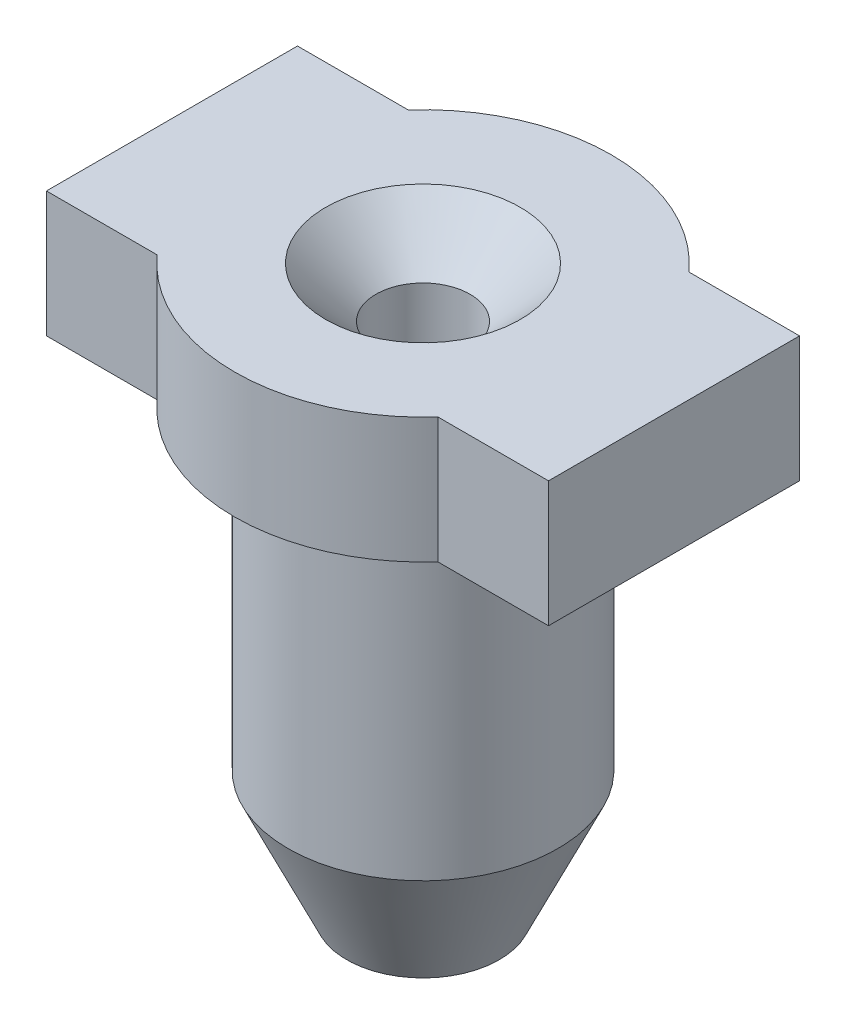
ISO-10303-21;
HEADER;
FILE_DESCRIPTION(('STEP AP214'),'2;1');
FILE_NAME('part.step','',(''),(''),'','','');
FILE_SCHEMA(('AUTOMOTIVE_DESIGN { 1 0 10303 214 1 1 1 1 }'));
ENDSEC;
DATA;
#1=APPLICATION_CONTEXT('core data for automotive mechanical design processes');
#2=APPLICATION_PROTOCOL_DEFINITION('international standard','automotive_design',2000,#1);
#3=PRODUCT_CONTEXT('',#1,'mechanical');
#4=PRODUCT('Part','Part','',(#3));
#5=PRODUCT_RELATED_PRODUCT_CATEGORY('part','',(#4));
#6=PRODUCT_DEFINITION_FORMATION('','',#4);
#7=PRODUCT_DEFINITION_CONTEXT('part definition',#1,'design');
#8=PRODUCT_DEFINITION('design','',#6,#7);
#9=PRODUCT_DEFINITION_SHAPE('','',#8);
#10=(LENGTH_UNIT() NAMED_UNIT(*) SI_UNIT(.MILLI.,.METRE.));
#11=(NAMED_UNIT(*) PLANE_ANGLE_UNIT() SI_UNIT($,.RADIAN.));
#12=(NAMED_UNIT(*) SI_UNIT($,.STERADIAN.) SOLID_ANGLE_UNIT());
#13=UNCERTAINTY_MEASURE_WITH_UNIT(LENGTH_MEASURE(1.E-05),#10,'distance_accuracy_value','');
#14=(GEOMETRIC_REPRESENTATION_CONTEXT(3) GLOBAL_UNCERTAINTY_ASSIGNED_CONTEXT((#13)) GLOBAL_UNIT_ASSIGNED_CONTEXT((#10,
#11,#12)) REPRESENTATION_CONTEXT('',''));
#15=CARTESIAN_POINT('',(0.,0.,0.));
#16=DIRECTION('',(0.,0.,1.));
#17=DIRECTION('',(1.,0.,0.));
#18=AXIS2_PLACEMENT_3D('',#15,#16,#17);
#19=CARTESIAN_POINT('',(0.,10.,0.));
#20=DIRECTION('',(0.,-1.,0.));
#21=DIRECTION('',(0.,0.,-1.));
#22=AXIS2_PLACEMENT_3D('',#19,#20,#21);
#23=CYLINDRICAL_SURFACE('',#22,15.);
#24=DIRECTION('',(0.,-1.,0.));
#25=VECTOR('',#24,1.);
#26=CARTESIAN_POINT('',(-11.1803398874989,10.,-10.));
#27=LINE('',#26,#25);
#28=CARTESIAN_POINT('',(-11.1803398874989,10.,-10.));
#29=VERTEX_POINT('',#28);
#30=CARTESIAN_POINT('',(-11.1803398874989,0.,-10.));
#31=VERTEX_POINT('',#30);
#32=EDGE_CURVE('E69',#29,#31,#27,.T.);
#33=ORIENTED_EDGE('',*,*,#32,.F.);
#34=CARTESIAN_POINT('',(0.,10.,0.));
#35=DIRECTION('',(0.,1.,0.));
#36=DIRECTION('',(0.,0.,1.));
#37=AXIS2_PLACEMENT_3D('',#34,#35,#36);
#38=CIRCLE('',#37,15.);
#39=CARTESIAN_POINT('',(11.1803398874989,10.,-10.));
#40=VERTEX_POINT('',#39);
#41=EDGE_CURVE('E182',#40,#29,#38,.T.);
#42=ORIENTED_EDGE('',*,*,#41,.F.);
#43=DIRECTION('',(0.,-1.,0.));
#44=VECTOR('',#43,1.);
#45=CARTESIAN_POINT('',(11.1803398874989,10.,-10.));
#46=LINE('',#45,#44);
#47=CARTESIAN_POINT('',(11.1803398874989,0.,-10.));
#48=VERTEX_POINT('',#47);
#49=EDGE_CURVE('E162',#48,#40,#46,.F.);
#50=ORIENTED_EDGE('',*,*,#49,.F.);
#51=CARTESIAN_POINT('',(0.,0.,0.));
#52=DIRECTION('',(0.,1.,0.));
#53=DIRECTION('',(0.,0.,1.));
#54=AXIS2_PLACEMENT_3D('',#51,#52,#53);
#55=CIRCLE('',#54,15.);
#56=EDGE_CURVE('E183',#48,#31,#55,.T.);
#57=ORIENTED_EDGE('',*,*,#56,.T.);
#58=EDGE_LOOP('',(#33,#42,#50,#57));
#59=FACE_BOUND('',#58,.T.);
#60=ADVANCED_FACE('F45',(#59),#23,.T.);
#61=CARTESIAN_POINT('',(-11.180339887499,10.,10.));
#62=VERTEX_POINT('',#61);
#63=CARTESIAN_POINT('',(11.180339887499,10.,10.));
#64=VERTEX_POINT('',#63);
#65=EDGE_CURVE('E61',#62,#64,#38,.T.);
#66=ORIENTED_EDGE('',*,*,#65,.F.);
#67=DIRECTION('',(0.,-1.,0.));
#68=VECTOR('',#67,1.);
#69=CARTESIAN_POINT('',(-11.180339887499,10.,10.));
#70=LINE('',#69,#68);
#71=CARTESIAN_POINT('',(-11.180339887499,0.,10.));
#72=VERTEX_POINT('',#71);
#73=EDGE_CURVE('E159',#62,#72,#70,.T.);
#74=ORIENTED_EDGE('',*,*,#73,.T.);
#75=CARTESIAN_POINT('',(11.180339887499,0.,10.));
#76=VERTEX_POINT('',#75);
#77=EDGE_CURVE('E119',#72,#76,#55,.T.);
#78=ORIENTED_EDGE('',*,*,#77,.T.);
#79=DIRECTION('',(0.,-1.,0.));
#80=VECTOR('',#79,1.);
#81=CARTESIAN_POINT('',(11.180339887499,10.,10.));
#82=LINE('',#81,#80);
#83=EDGE_CURVE('E156',#76,#64,#82,.F.);
#84=ORIENTED_EDGE('',*,*,#83,.T.);
#85=EDGE_LOOP('',(#66,#74,#78,#84));
#86=FACE_BOUND('',#85,.T.);
#87=ADVANCED_FACE('F211',(#86),#23,.T.);
#88=CARTESIAN_POINT('',(0.,10.,0.));
#89=DIRECTION('',(0.,1.,0.));
#90=DIRECTION('',(0.,0.,1.));
#91=AXIS2_PLACEMENT_3D('',#88,#89,#90);
#92=PLANE('',#91);
#93=ORIENTED_EDGE('',*,*,#65,.T.);
#94=DIRECTION('',(1.,0.,0.));
#95=VECTOR('',#94,1.);
#96=CARTESIAN_POINT('',(0.,10.,10.));
#97=LINE('',#96,#95);
#98=CARTESIAN_POINT('',(20.,10.,10.));
#99=VERTEX_POINT('',#98);
#100=EDGE_CURVE('E263',#64,#99,#97,.T.);
#101=ORIENTED_EDGE('',*,*,#100,.T.);
#102=DIRECTION('',(0.,0.,1.));
#103=VECTOR('',#102,1.);
#104=CARTESIAN_POINT('',(20.,10.,0.));
#105=LINE('',#104,#103);
#106=CARTESIAN_POINT('',(20.,10.,-10.));
#107=VERTEX_POINT('',#106);
#108=EDGE_CURVE('E277',#107,#99,#105,.T.);
#109=ORIENTED_EDGE('',*,*,#108,.F.);
#110=DIRECTION('',(1.,0.,0.));
#111=VECTOR('',#110,1.);
#112=CARTESIAN_POINT('',(0.,10.,-10.));
#113=LINE('',#112,#111);
#114=EDGE_CURVE('E281',#40,#107,#113,.T.);
#115=ORIENTED_EDGE('',*,*,#114,.F.);
#116=ORIENTED_EDGE('',*,*,#41,.T.);
#117=CARTESIAN_POINT('',(-20.,10.,-10.));
#118=VERTEX_POINT('',#117);
#119=EDGE_CURVE('E153',#118,#29,#113,.T.);
#120=ORIENTED_EDGE('',*,*,#119,.F.);
#121=DIRECTION('',(0.,0.,1.));
#122=VECTOR('',#121,1.);
#123=CARTESIAN_POINT('',(-20.,10.,0.));
#124=LINE('',#123,#122);
#125=CARTESIAN_POINT('',(-20.,10.,10.));
#126=VERTEX_POINT('',#125);
#127=EDGE_CURVE('E271',#118,#126,#124,.T.);
#128=ORIENTED_EDGE('',*,*,#127,.T.);
#129=EDGE_CURVE('E132',#126,#62,#97,.T.);
#130=ORIENTED_EDGE('',*,*,#129,.T.);
#131=EDGE_LOOP('',(#93,#101,#109,#115,#116,#120,#128,#130));
#132=FACE_BOUND('',#131,.T.);
#133=CARTESIAN_POINT('',(0.,10.,0.));
#134=DIRECTION('',(0.,1.,0.));
#135=DIRECTION('',(0.,0.,1.));
#136=AXIS2_PLACEMENT_3D('',#133,#134,#135);
#137=CIRCLE('',#136,7.75000000000001);
#138=CARTESIAN_POINT('',(0.,10.,7.75000000000001));
#139=VERTEX_POINT('',#138);
#140=EDGE_CURVE('E190',#139,#139,#137,.F.);
#141=ORIENTED_EDGE('',*,*,#140,.T.);
#142=EDGE_LOOP('',(#141));
#143=FACE_BOUND('',#142,.T.);
#144=ADVANCED_FACE('F216',(#132,#143),#92,.T.);
#145=CARTESIAN_POINT('',(0.,0.,0.));
#146=DIRECTION('',(0.,1.,0.));
#147=DIRECTION('',(0.,0.,1.));
#148=AXIS2_PLACEMENT_3D('',#145,#146,#147);
#149=PLANE('',#148);
#150=CARTESIAN_POINT('',(0.,0.,0.));
#151=DIRECTION('',(0.,1.,0.));
#152=DIRECTION('',(0.,0.,1.));
#153=AXIS2_PLACEMENT_3D('',#150,#151,#152);
#154=CIRCLE('',#153,13.75);
#155=CARTESIAN_POINT('',(0.,0.,13.75));
#156=VERTEX_POINT('',#155);
#157=EDGE_CURVE('E11',#156,#156,#154,.T.);
#158=ORIENTED_EDGE('',*,*,#157,.T.);
#159=EDGE_LOOP('',(#158));
#160=FACE_BOUND('',#159,.T.);
#161=ORIENTED_EDGE('',*,*,#77,.F.);
#162=DIRECTION('',(-1.,0.,0.));
#163=VECTOR('',#162,1.);
#164=CARTESIAN_POINT('',(0.,0.,10.));
#165=LINE('',#164,#163);
#166=CARTESIAN_POINT('',(-20.,0.,10.));
#167=VERTEX_POINT('',#166);
#168=EDGE_CURVE('E112',#72,#167,#165,.T.);
#169=ORIENTED_EDGE('',*,*,#168,.T.);
#170=DIRECTION('',(0.,0.,-1.));
#171=VECTOR('',#170,1.);
#172=CARTESIAN_POINT('',(-20.,0.,0.));
#173=LINE('',#172,#171);
#174=CARTESIAN_POINT('',(-20.,0.,-10.));
#175=VERTEX_POINT('',#174);
#176=EDGE_CURVE('E116',#167,#175,#173,.T.);
#177=ORIENTED_EDGE('',*,*,#176,.T.);
#178=DIRECTION('',(-1.,0.,0.));
#179=VECTOR('',#178,1.);
#180=CARTESIAN_POINT('',(0.,0.,-10.));
#181=LINE('',#180,#179);
#182=EDGE_CURVE('E138',#31,#175,#181,.T.);
#183=ORIENTED_EDGE('',*,*,#182,.F.);
#184=ORIENTED_EDGE('',*,*,#56,.F.);
#185=CARTESIAN_POINT('',(20.,0.,-10.));
#186=VERTEX_POINT('',#185);
#187=EDGE_CURVE('E141',#186,#48,#181,.T.);
#188=ORIENTED_EDGE('',*,*,#187,.F.);
#189=DIRECTION('',(0.,0.,-1.));
#190=VECTOR('',#189,1.);
#191=CARTESIAN_POINT('',(20.,0.,0.));
#192=LINE('',#191,#190);
#193=CARTESIAN_POINT('',(20.,0.,10.));
#194=VERTEX_POINT('',#193);
#195=EDGE_CURVE('E149',#194,#186,#192,.T.);
#196=ORIENTED_EDGE('',*,*,#195,.F.);
#197=EDGE_CURVE('E123',#194,#76,#165,.T.);
#198=ORIENTED_EDGE('',*,*,#197,.T.);
#199=EDGE_LOOP('',(#161,#169,#177,#183,#184,#188,#196,#198));
#200=FACE_BOUND('',#199,.T.);
#201=ADVANCED_FACE('F114',(#160,#200),#149,.F.);
#202=CARTESIAN_POINT('',(0.,-25.,0.));
#203=DIRECTION('',(0.,1.,0.));
#204=DIRECTION('',(0.,0.,1.));
#205=AXIS2_PLACEMENT_3D('',#202,#203,#204);
#206=CYLINDRICAL_SURFACE('',#205,10.75);
#207=CARTESIAN_POINT('',(0.,-3.,0.));
#208=DIRECTION('',(0.,1.,0.));
#209=DIRECTION('',(0.,0.,1.));
#210=AXIS2_PLACEMENT_3D('',#207,#208,#209);
#211=CIRCLE('',#210,10.75);
#212=CARTESIAN_POINT('',(0.,-3.,10.75));
#213=VERTEX_POINT('',#212);
#214=EDGE_CURVE('E54',#213,#213,#211,.F.);
#215=ORIENTED_EDGE('',*,*,#214,.T.);
#216=EDGE_LOOP('',(#215));
#217=FACE_BOUND('',#216,.T.);
#218=CARTESIAN_POINT('',(0.,-25.,0.));
#219=DIRECTION('',(0.,-1.,0.));
#220=DIRECTION('',(0.,0.,-1.));
#221=AXIS2_PLACEMENT_3D('',#218,#219,#220);
#222=CIRCLE('',#221,10.75);
#223=CARTESIAN_POINT('',(0.,-25.,-10.75));
#224=VERTEX_POINT('',#223);
#225=EDGE_CURVE('E176',#224,#224,#222,.T.);
#226=ORIENTED_EDGE('',*,*,#225,.F.);
#227=EDGE_LOOP('',(#226));
#228=FACE_BOUND('',#227,.T.);
#229=ADVANCED_FACE('F197',(#217,#228),#206,.T.);
#230=CARTESIAN_POINT('',(0.,-18.8,0.));
#231=DIRECTION('',(0.,1.,0.));
#232=DIRECTION('',(0.,0.,1.));
#233=AXIS2_PLACEMENT_3D('',#230,#231,#232);
#234=CYLINDRICAL_SURFACE('',#233,3.75);
#235=CARTESIAN_POINT('',(0.,6.,0.));
#236=DIRECTION('',(0.,1.,0.));
#237=DIRECTION('',(0.,0.,1.));
#238=AXIS2_PLACEMENT_3D('',#235,#236,#237);
#239=CIRCLE('',#238,3.75);
#240=CARTESIAN_POINT('',(0.,6.,3.75));
#241=VERTEX_POINT('',#240);
#242=EDGE_CURVE('E186',#241,#241,#239,.T.);
#243=ORIENTED_EDGE('',*,*,#242,.T.);
#244=EDGE_LOOP('',(#243));
#245=FACE_BOUND('',#244,.T.);
#246=CARTESIAN_POINT('',(0.,-18.8,0.));
#247=DIRECTION('',(0.,1.,0.));
#248=DIRECTION('',(0.,0.,1.));
#249=AXIS2_PLACEMENT_3D('',#246,#247,#248);
#250=CIRCLE('',#249,3.75);
#251=CARTESIAN_POINT('',(0.,-18.8,3.75));
#252=VERTEX_POINT('',#251);
#253=EDGE_CURVE('E172',#252,#252,#250,.T.);
#254=ORIENTED_EDGE('',*,*,#253,.F.);
#255=EDGE_LOOP('',(#254));
#256=FACE_BOUND('',#255,.T.);
#257=ADVANCED_FACE('F238',(#245,#256),#234,.F.);
#258=CARTESIAN_POINT('',(0.,-18.8,0.));
#259=DIRECTION('',(0.,1.,0.));
#260=DIRECTION('',(0.,0.,1.));
#261=AXIS2_PLACEMENT_3D('',#258,#259,#260);
#262=PLANE('',#261);
#263=ORIENTED_EDGE('',*,*,#253,.T.);
#264=EDGE_LOOP('',(#263));
#265=FACE_BOUND('',#264,.T.);
#266=ADVANCED_FACE('F241',(#265),#262,.T.);
#267=CARTESIAN_POINT('',(0.,-25.,0.));
#268=DIRECTION('',(0.,1.,0.));
#269=DIRECTION('',(0.,0.,-1.));
#270=AXIS2_PLACEMENT_3D('',#267,#268,#269);
#271=CONICAL_SURFACE('',#270,10.75,0.436332312998583);
#272=CARTESIAN_POINT('',(0.,-35.,0.));
#273=DIRECTION('',(0.,-1.,0.));
#274=DIRECTION('',(0.,0.,-1.));
#275=AXIS2_PLACEMENT_3D('',#272,#273,#274);
#276=CIRCLE('',#275,6.08692341845);
#277=CARTESIAN_POINT('',(0.,-35.,-6.08692341845));
#278=VERTEX_POINT('',#277);
#279=EDGE_CURVE('E168',#278,#278,#276,.T.);
#280=ORIENTED_EDGE('',*,*,#279,.F.);
#281=EDGE_LOOP('',(#280));
#282=FACE_BOUND('',#281,.T.);
#283=ORIENTED_EDGE('',*,*,#225,.T.);
#284=EDGE_LOOP('',(#283));
#285=FACE_BOUND('',#284,.T.);
#286=ADVANCED_FACE('F231',(#282,#285),#271,.T.);
#287=CARTESIAN_POINT('',(0.,-35.,0.));
#288=DIRECTION('',(0.,-1.,0.));
#289=DIRECTION('',(0.,0.,-1.));
#290=AXIS2_PLACEMENT_3D('',#287,#288,#289);
#291=PLANE('',#290);
#292=ORIENTED_EDGE('',*,*,#279,.T.);
#293=EDGE_LOOP('',(#292));
#294=FACE_BOUND('',#293,.T.);
#295=ADVANCED_FACE('F224',(#294),#291,.T.);
#296=CARTESIAN_POINT('',(0.,6.,0.));
#297=DIRECTION('',(0.,1.,0.));
#298=DIRECTION('',(0.,0.,1.));
#299=AXIS2_PLACEMENT_3D('',#296,#297,#298);
#300=CONICAL_SURFACE('',#299,3.75,0.78539816339745);
#301=ORIENTED_EDGE('',*,*,#140,.F.);
#302=EDGE_LOOP('',(#301));
#303=FACE_BOUND('',#302,.T.);
#304=ORIENTED_EDGE('',*,*,#242,.F.);
#305=EDGE_LOOP('',(#304));
#306=FACE_BOUND('',#305,.T.);
#307=ADVANCED_FACE('F220',(#303,#306),#300,.F.);
#308=CARTESIAN_POINT('',(-20.,-44.7213595499958,0.));
#309=DIRECTION('',(-1.,0.,0.));
#310=DIRECTION('',(0.,0.,1.));
#311=AXIS2_PLACEMENT_3D('',#308,#309,#310);
#312=PLANE('',#311);
#313=ORIENTED_EDGE('',*,*,#176,.F.);
#314=DIRECTION('',(0.,1.,0.));
#315=VECTOR('',#314,1.);
#316=CARTESIAN_POINT('',(-20.,-44.7213595499958,10.));
#317=LINE('',#316,#315);
#318=EDGE_CURVE('E128',#167,#126,#317,.T.);
#319=ORIENTED_EDGE('',*,*,#318,.T.);
#320=ORIENTED_EDGE('',*,*,#127,.F.);
#321=DIRECTION('',(0.,1.,0.));
#322=VECTOR('',#321,1.);
#323=CARTESIAN_POINT('',(-20.,-44.7213595499958,-10.));
#324=LINE('',#323,#322);
#325=EDGE_CURVE('E130',#175,#118,#324,.T.);
#326=ORIENTED_EDGE('',*,*,#325,.F.);
#327=EDGE_LOOP('',(#313,#319,#320,#326));
#328=FACE_BOUND('',#327,.T.);
#329=ADVANCED_FACE('F126',(#328),#312,.T.);
#330=CARTESIAN_POINT('',(0.,-44.7213595499958,10.));
#331=DIRECTION('',(0.,0.,1.));
#332=DIRECTION('',(1.,0.,0.));
#333=AXIS2_PLACEMENT_3D('',#330,#331,#332);
#334=PLANE('',#333);
#335=ORIENTED_EDGE('',*,*,#73,.F.);
#336=ORIENTED_EDGE('',*,*,#129,.F.);
#337=ORIENTED_EDGE('',*,*,#318,.F.);
#338=ORIENTED_EDGE('',*,*,#168,.F.);
#339=EDGE_LOOP('',(#335,#336,#337,#338));
#340=FACE_BOUND('',#339,.T.);
#341=ADVANCED_FACE('F134',(#340),#334,.T.);
#342=CARTESIAN_POINT('',(0.,-44.7213595499958,-10.));
#343=DIRECTION('',(0.,0.,1.));
#344=DIRECTION('',(1.,0.,0.));
#345=AXIS2_PLACEMENT_3D('',#342,#343,#344);
#346=PLANE('',#345);
#347=ORIENTED_EDGE('',*,*,#119,.T.);
#348=ORIENTED_EDGE('',*,*,#32,.T.);
#349=ORIENTED_EDGE('',*,*,#182,.T.);
#350=ORIENTED_EDGE('',*,*,#325,.T.);
#351=EDGE_LOOP('',(#347,#348,#349,#350));
#352=FACE_BOUND('',#351,.T.);
#353=ADVANCED_FACE('F294',(#352),#346,.F.);
#354=ORIENTED_EDGE('',*,*,#187,.T.);
#355=ORIENTED_EDGE('',*,*,#49,.T.);
#356=ORIENTED_EDGE('',*,*,#114,.T.);
#357=DIRECTION('',(0.,1.,0.));
#358=VECTOR('',#357,1.);
#359=CARTESIAN_POINT('',(20.,-44.7213595499958,-10.));
#360=LINE('',#359,#358);
#361=EDGE_CURVE('E152',#186,#107,#360,.T.);
#362=ORIENTED_EDGE('',*,*,#361,.F.);
#363=EDGE_LOOP('',(#354,#355,#356,#362));
#364=FACE_BOUND('',#363,.T.);
#365=ADVANCED_FACE('F297',(#364),#346,.F.);
#366=ORIENTED_EDGE('',*,*,#83,.F.);
#367=ORIENTED_EDGE('',*,*,#197,.F.);
#368=DIRECTION('',(0.,1.,0.));
#369=VECTOR('',#368,1.);
#370=CARTESIAN_POINT('',(20.,-44.7213595499958,10.));
#371=LINE('',#370,#369);
#372=EDGE_CURVE('E144',#194,#99,#371,.T.);
#373=ORIENTED_EDGE('',*,*,#372,.T.);
#374=ORIENTED_EDGE('',*,*,#100,.F.);
#375=EDGE_LOOP('',(#366,#367,#373,#374));
#376=FACE_BOUND('',#375,.T.);
#377=ADVANCED_FACE('F206',(#376),#334,.T.);
#378=CARTESIAN_POINT('',(20.,-44.7213595499958,0.));
#379=DIRECTION('',(-1.,0.,0.));
#380=DIRECTION('',(0.,0.,1.));
#381=AXIS2_PLACEMENT_3D('',#378,#379,#380);
#382=PLANE('',#381);
#383=ORIENTED_EDGE('',*,*,#372,.F.);
#384=ORIENTED_EDGE('',*,*,#195,.T.);
#385=ORIENTED_EDGE('',*,*,#361,.T.);
#386=ORIENTED_EDGE('',*,*,#108,.T.);
#387=EDGE_LOOP('',(#383,#384,#385,#386));
#388=FACE_BOUND('',#387,.T.);
#389=ADVANCED_FACE('F201',(#388),#382,.F.);
#390=CARTESIAN_POINT('',(0.,-3.,0.));
#391=DIRECTION('',(0.,1.,0.));
#392=DIRECTION('',(0.,0.,1.));
#393=AXIS2_PLACEMENT_3D('',#390,#391,#392);
#394=TOROIDAL_SURFACE('',#393,13.75,3.);
#395=ORIENTED_EDGE('',*,*,#157,.F.);
#396=EDGE_LOOP('',(#395));
#397=FACE_BOUND('',#396,.T.);
#398=ORIENTED_EDGE('',*,*,#214,.F.);
#399=EDGE_LOOP('',(#398));
#400=FACE_BOUND('',#399,.T.);
#401=ADVANCED_FACE('F47',(#397,#400),#394,.F.);
#402=CLOSED_SHELL('',(#60,#87,#144,#201,#229,#257,#266,#286,#295,#307,#329,#341,#353,#365,#377,
#389,#401));
#403=MANIFOLD_SOLID_BREP('B2',#402);
#404=ADVANCED_BREP_SHAPE_REPRESENTATION('',(#18,#403),#14);
#405=SHAPE_DEFINITION_REPRESENTATION(#9,#404);
ENDSEC;
END-ISO-10303-21;
